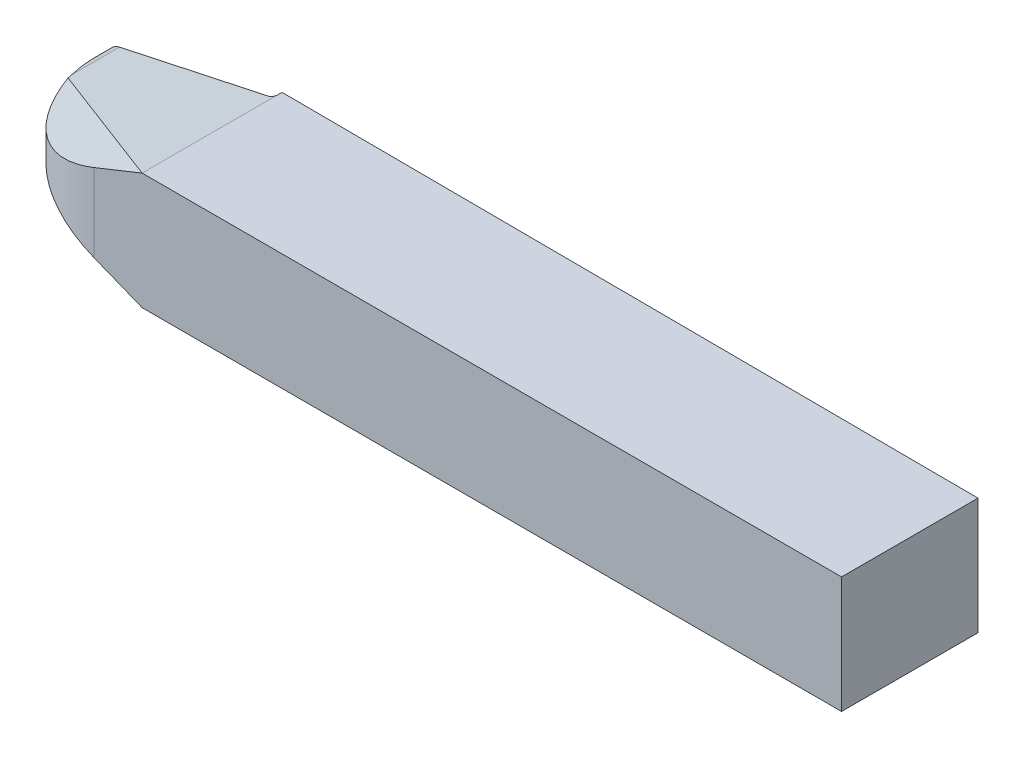
ISO-10303-21;
HEADER;
FILE_DESCRIPTION(('STEP AP214'),'2;1');
FILE_NAME('part.step','',(''),(''),'','','');
FILE_SCHEMA(('AUTOMOTIVE_DESIGN { 1 0 10303 214 1 1 1 1 }'));
ENDSEC;
DATA;
#1=APPLICATION_CONTEXT('core data for automotive mechanical design processes');
#2=APPLICATION_PROTOCOL_DEFINITION('international standard','automotive_design',2000,#1);
#3=PRODUCT_CONTEXT('',#1,'mechanical');
#4=PRODUCT('Part','Part','',(#3));
#5=PRODUCT_RELATED_PRODUCT_CATEGORY('part','',(#4));
#6=PRODUCT_DEFINITION_FORMATION('','',#4);
#7=PRODUCT_DEFINITION_CONTEXT('part definition',#1,'design');
#8=PRODUCT_DEFINITION('design','',#6,#7);
#9=PRODUCT_DEFINITION_SHAPE('','',#8);
#10=(LENGTH_UNIT() NAMED_UNIT(*) SI_UNIT(.MILLI.,.METRE.));
#11=(NAMED_UNIT(*) PLANE_ANGLE_UNIT() SI_UNIT($,.RADIAN.));
#12=(NAMED_UNIT(*) SI_UNIT($,.STERADIAN.) SOLID_ANGLE_UNIT());
#13=UNCERTAINTY_MEASURE_WITH_UNIT(LENGTH_MEASURE(1.E-05),#10,'distance_accuracy_value','');
#14=(GEOMETRIC_REPRESENTATION_CONTEXT(3) GLOBAL_UNCERTAINTY_ASSIGNED_CONTEXT((#13)) GLOBAL_UNIT_ASSIGNED_CONTEXT((#10,
#11,#12)) REPRESENTATION_CONTEXT('',''));
#15=CARTESIAN_POINT('',(0.,0.,0.));
#16=DIRECTION('',(0.,0.,1.));
#17=DIRECTION('',(1.,0.,0.));
#18=AXIS2_PLACEMENT_3D('',#15,#16,#17);
#19=CARTESIAN_POINT('',(-27.,9.99999999999999,24.));
#20=DIRECTION('',(0.,0.,1.));
#21=DIRECTION('',(1.,0.,0.));
#22=AXIS2_PLACEMENT_3D('',#19,#20,#21);
#23=PLANE('',#22);
#24=DIRECTION('',(0.,-1.,0.));
#25=VECTOR('',#24,1.);
#26=CARTESIAN_POINT('',(-8.22267962207384,24.,24.));
#27=LINE('',#26,#25);
#28=CARTESIAN_POINT('',(-8.22267962207384,3.28828490923953,24.));
#29=VERTEX_POINT('',#28);
#30=CARTESIAN_POINT('',(-8.22267962207384,16.7117150907605,24.));
#31=VERTEX_POINT('',#30);
#32=EDGE_CURVE('E129',#29,#31,#27,.F.);
#33=ORIENTED_EDGE('',*,*,#32,.F.);
#34=DIRECTION('',(0.928507329602021,-0.371314070397721,0.));
#35=VECTOR('',#34,1.);
#36=CARTESIAN_POINT('',(-26.7250766098527,10.6874729593666,24.));
#37=LINE('',#36,#35);
#38=CARTESIAN_POINT('',(0.,0.,24.0000000000001));
#39=VERTEX_POINT('',#38);
#40=EDGE_CURVE('E120',#29,#39,#37,.T.);
#41=ORIENTED_EDGE('',*,*,#40,.T.);
#42=DIRECTION('',(1.,0.,0.));
#43=VECTOR('',#42,1.);
#44=CARTESIAN_POINT('',(0.,0.,24.));
#45=LINE('',#44,#43);
#46=CARTESIAN_POINT('',(120.,0.,24.));
#47=VERTEX_POINT('',#46);
#48=EDGE_CURVE('E60',#39,#47,#45,.T.);
#49=ORIENTED_EDGE('',*,*,#48,.T.);
#50=DIRECTION('',(0.,1.,0.));
#51=VECTOR('',#50,1.);
#52=CARTESIAN_POINT('',(120.,0.,24.));
#53=LINE('',#52,#51);
#54=CARTESIAN_POINT('',(120.,20.,24.));
#55=VERTEX_POINT('',#54);
#56=EDGE_CURVE('E55',#47,#55,#53,.T.);
#57=ORIENTED_EDGE('',*,*,#56,.T.);
#58=DIRECTION('',(-1.,0.,0.));
#59=VECTOR('',#58,1.);
#60=CARTESIAN_POINT('',(0.,20.,24.));
#61=LINE('',#60,#59);
#62=CARTESIAN_POINT('',(0.,20.,24.));
#63=VERTEX_POINT('',#62);
#64=EDGE_CURVE('E162',#55,#63,#61,.T.);
#65=ORIENTED_EDGE('',*,*,#64,.T.);
#66=DIRECTION('',(-0.928507329602021,-0.371314070397722,0.));
#67=VECTOR('',#66,1.);
#68=CARTESIAN_POINT('',(-26.7250766098527,9.31252704063335,24.));
#69=LINE('',#68,#67);
#70=EDGE_CURVE('E130',#63,#31,#69,.T.);
#71=ORIENTED_EDGE('',*,*,#70,.T.);
#72=EDGE_LOOP('',(#33,#41,#49,#57,#65,#71));
#73=FACE_BOUND('',#72,.T.);
#74=ADVANCED_FACE('F40',(#73),#23,.T.);
#75=CARTESIAN_POINT('',(-8.22267962207384,24.,4.));
#76=DIRECTION('',(0.,-1.,0.));
#77=DIRECTION('',(0.,0.,-1.));
#78=AXIS2_PLACEMENT_3D('',#75,#76,#77);
#79=CYLINDRICAL_SURFACE('',#78,20.);
#80=CARTESIAN_POINT('',(-8.22267962207384,-2.07069893938296,4.));
#81=DIRECTION('',(-0.360329679452503,-0.901039780384388,0.241432881502315));
#82=DIRECTION('',(0.748545274372848,-0.433736457039127,-0.501550254759404));
#83=AXIS2_PLACEMENT_3D('',#80,#81,#82);
#84=ELLIPSE('',#83,22.1965782592506,20.);
#85=CARTESIAN_POINT('',(-27.5411961478552,7.04186590283247,9.17638090205043));
#86=VERTEX_POINT('',#85);
#87=EDGE_CURVE('E122',#29,#86,#84,.T.);
#88=ORIENTED_EDGE('',*,*,#87,.F.);
#89=ORIENTED_EDGE('',*,*,#32,.T.);
#90=CARTESIAN_POINT('',(-8.22267962207384,22.070698939383,4.));
#91=DIRECTION('',(-0.360329679452504,0.901039780384388,0.241432881502315));
#92=DIRECTION('',(-0.748545274372848,-0.433736457039127,0.501550254759404));
#93=AXIS2_PLACEMENT_3D('',#90,#91,#92);
#94=ELLIPSE('',#93,22.1965782592506,20.);
#95=CARTESIAN_POINT('',(-27.5411961478552,12.9581340971675,9.17638090205043));
#96=VERTEX_POINT('',#95);
#97=EDGE_CURVE('E48',#96,#31,#94,.T.);
#98=ORIENTED_EDGE('',*,*,#97,.F.);
#99=DIRECTION('',(0.,-1.,0.));
#100=VECTOR('',#99,1.);
#101=CARTESIAN_POINT('',(-27.5411961478552,24.,9.17638090205043));
#102=LINE('',#101,#100);
#103=EDGE_CURVE('E181',#96,#86,#102,.T.);
#104=ORIENTED_EDGE('',*,*,#103,.T.);
#105=EDGE_LOOP('',(#88,#89,#98,#104));
#106=FACE_BOUND('',#105,.T.);
#107=ADVANCED_FACE('F261',(#106),#79,.T.);
#108=CARTESIAN_POINT('',(0.,0.,24.));
#109=DIRECTION('',(0.247715827823314,0.968832735122947,0.));
#110=DIRECTION('',(-0.968832735122947,0.247715827823314,0.));
#111=AXIS2_PLACEMENT_3D('',#108,#109,#110);
#112=PLANE('',#111);
#113=DIRECTION('',(0.859051054409004,-0.219646318059651,0.462370826157553));
#114=VECTOR('',#113,1.);
#115=CARTESIAN_POINT('',(0.,0.,24.0000000000001));
#116=LINE('',#115,#114);
#117=EDGE_CURVE('E12',#86,#39,#116,.T.);
#118=ORIENTED_EDGE('',*,*,#117,.F.);
#119=DIRECTION('',(-0.258254179623644,0.0660316745864117,-0.963817719622457));
#120=VECTOR('',#119,1.);
#121=CARTESIAN_POINT('',(-21.8944989920391,5.59809113169716,30.2501415825108));
#122=LINE('',#121,#120);
#123=CARTESIAN_POINT('',(-27.7431474834699,7.09350179463115,8.42268825687986));
#124=VERTEX_POINT('',#123);
#125=EDGE_CURVE('E199',#86,#124,#122,.T.);
#126=ORIENTED_EDGE('',*,*,#125,.T.);
#127=DIRECTION('',(0.,0.,-1.));
#128=VECTOR('',#127,1.);
#129=CARTESIAN_POINT('',(-27.7431474834699,7.09350179463115,24.));
#130=LINE('',#129,#128);
#131=CARTESIAN_POINT('',(-27.7431474834699,7.09350179463115,0.118276628560669));
#132=VERTEX_POINT('',#131);
#133=EDGE_CURVE('E213',#124,#132,#130,.T.);
#134=ORIENTED_EDGE('',*,*,#133,.T.);
#135=DIRECTION('',(0.967586301365597,-0.247397133626849,0.0507090493192555));
#136=VECTOR('',#135,1.);
#137=CARTESIAN_POINT('',(1.10042692495214,-0.281362465151417,1.62990430989102));
#138=LINE('',#137,#136);
#139=CARTESIAN_POINT('',(-0.805596322325437,0.205978754269632,1.53001386423937));
#140=VERTEX_POINT('',#139);
#141=EDGE_CURVE('E208',#132,#140,#138,.T.);
#142=ORIENTED_EDGE('',*,*,#141,.T.);
#143=CARTESIAN_POINT('',(-0.765531499276701,0.195734787020885,0.765531499276701));
#144=DIRECTION('',(0.247715827823314,0.968832735122947,0.));
#145=DIRECTION('',(0.968832735122947,-0.247715827823314,0.));
#146=AXIS2_PLACEMENT_3D('',#143,#144,#145);
#147=ELLIPSE('',#146,0.790158581067715,0.765531499276702);
#148=CARTESIAN_POINT('',(0.,0.,0.765531499276701));
#149=VERTEX_POINT('',#148);
#150=EDGE_CURVE('E140',#140,#149,#147,.T.);
#151=ORIENTED_EDGE('',*,*,#150,.T.);
#152=DIRECTION('',(0.,0.,-1.));
#153=VECTOR('',#152,1.);
#154=CARTESIAN_POINT('',(0.,0.,24.));
#155=LINE('',#154,#153);
#156=EDGE_CURVE('E136',#39,#149,#155,.T.);
#157=ORIENTED_EDGE('',*,*,#156,.F.);
#158=EDGE_LOOP('',(#118,#126,#134,#142,#151,#157));
#159=FACE_BOUND('',#158,.T.);
#160=ADVANCED_FACE('F42',(#159),#112,.F.);
#161=CARTESIAN_POINT('',(0.,20.,24.));
#162=DIRECTION('',(0.247715827823314,-0.968832735122947,0.));
#163=DIRECTION('',(0.968832735122947,0.247715827823314,0.));
#164=AXIS2_PLACEMENT_3D('',#161,#162,#163);
#165=PLANE('',#164);
#166=DIRECTION('',(-0.859051054409004,-0.219646318059651,-0.462370826157553));
#167=VECTOR('',#166,1.);
#168=CARTESIAN_POINT('',(0.,20.,24.0000000000001));
#169=LINE('',#168,#167);
#170=EDGE_CURVE('E157',#63,#96,#169,.T.);
#171=ORIENTED_EDGE('',*,*,#170,.F.);
#172=DIRECTION('',(0.,0.,-1.));
#173=VECTOR('',#172,1.);
#174=CARTESIAN_POINT('',(0.,20.,24.));
#175=LINE('',#174,#173);
#176=CARTESIAN_POINT('',(0.,20.,0.765531499276701));
#177=VERTEX_POINT('',#176);
#178=EDGE_CURVE('E219',#63,#177,#175,.T.);
#179=ORIENTED_EDGE('',*,*,#178,.T.);
#180=CARTESIAN_POINT('',(-0.765531499276701,19.8042652129791,0.765531499276701));
#181=DIRECTION('',(0.247715827823314,-0.968832735122947,0.));
#182=DIRECTION('',(-0.968832735122947,-0.247715827823314,0.));
#183=AXIS2_PLACEMENT_3D('',#180,#181,#182);
#184=ELLIPSE('',#183,0.790158581067715,0.765531499276702);
#185=CARTESIAN_POINT('',(-0.805596322325437,19.7940212457304,1.53001386423937));
#186=VERTEX_POINT('',#185);
#187=EDGE_CURVE('E145',#177,#186,#184,.T.);
#188=ORIENTED_EDGE('',*,*,#187,.T.);
#189=DIRECTION('',(-0.967586301365597,-0.247397133626849,-0.0507090493192555));
#190=VECTOR('',#189,1.);
#191=CARTESIAN_POINT('',(1.10042692495214,20.2813624651514,1.62990430989102));
#192=LINE('',#191,#190);
#193=CARTESIAN_POINT('',(-27.7431474834699,12.9064982053688,0.118276628560669));
#194=VERTEX_POINT('',#193);
#195=EDGE_CURVE('E205',#186,#194,#192,.T.);
#196=ORIENTED_EDGE('',*,*,#195,.T.);
#197=DIRECTION('',(0.,0.,-1.));
#198=VECTOR('',#197,1.);
#199=CARTESIAN_POINT('',(-27.7431474834699,12.9064982053688,24.));
#200=LINE('',#199,#198);
#201=CARTESIAN_POINT('',(-27.7431474834699,12.9064982053688,8.42268825687986));
#202=VERTEX_POINT('',#201);
#203=EDGE_CURVE('E216',#202,#194,#200,.T.);
#204=ORIENTED_EDGE('',*,*,#203,.F.);
#205=DIRECTION('',(0.258254179623644,0.0660316745864117,0.963817719622457));
#206=VECTOR('',#205,1.);
#207=CARTESIAN_POINT('',(-21.8944989920391,14.4019088683028,30.2501415825108));
#208=LINE('',#207,#206);
#209=EDGE_CURVE('E196',#202,#96,#208,.T.);
#210=ORIENTED_EDGE('',*,*,#209,.T.);
#211=EDGE_LOOP('',(#171,#179,#188,#196,#204,#210));
#212=FACE_BOUND('',#211,.T.);
#213=ADVANCED_FACE('F233',(#212),#165,.F.);
#214=CARTESIAN_POINT('',(-27.,9.99999999999999,24.));
#215=DIRECTION('',(0.,0.,-1.));
#216=DIRECTION('',(-1.,0.,0.));
#217=AXIS2_PLACEMENT_3D('',#214,#215,#216);
#218=CYLINDRICAL_SURFACE('',#217,3.);
#219=ORIENTED_EDGE('',*,*,#203,.T.);
#220=CARTESIAN_POINT('',(-27.,9.99999999999999,0.157223337849101));
#221=DIRECTION('',(-0.0523359562429367,0.,0.998629534754574));
#222=DIRECTION('',(-0.998629534754574,0.,-0.0523359562429367));
#223=AXIS2_PLACEMENT_3D('',#220,#221,#222);
#224=ELLIPSE('',#223,3.00411703799376,3.);
#225=CARTESIAN_POINT('',(-30.,9.99999999999999,0.));
#226=VERTEX_POINT('',#225);
#227=EDGE_CURVE('E201',#194,#226,#224,.T.);
#228=ORIENTED_EDGE('',*,*,#227,.T.);
#229=CARTESIAN_POINT('',(-27.,9.99999999999999,11.1961524227066));
#230=DIRECTION('',(0.965925826289068,0.,-0.258819045102521));
#231=DIRECTION('',(-0.258819045102521,0.,-0.965925826289068));
#232=AXIS2_PLACEMENT_3D('',#229,#230,#231);
#233=ELLIPSE('',#232,11.5911099154688,3.);
#234=EDGE_CURVE('E195',#226,#202,#233,.T.);
#235=ORIENTED_EDGE('',*,*,#234,.T.);
#236=EDGE_LOOP('',(#219,#228,#235));
#237=FACE_BOUND('',#236,.T.);
#238=ADVANCED_FACE('F240',(#237),#218,.T.);
#239=CARTESIAN_POINT('',(0.,0.,24.));
#240=DIRECTION('',(0.,1.,0.));
#241=DIRECTION('',(0.,0.,1.));
#242=AXIS2_PLACEMENT_3D('',#239,#240,#241);
#243=PLANE('',#242);
#244=DIRECTION('',(0.,0.,1.));
#245=VECTOR('',#244,1.);
#246=CARTESIAN_POINT('',(0.,0.,0.));
#247=LINE('',#246,#245);
#248=CARTESIAN_POINT('',(0.,0.,0.));
#249=VERTEX_POINT('',#248);
#250=EDGE_CURVE('E170',#249,#149,#247,.T.);
#251=ORIENTED_EDGE('',*,*,#250,.F.);
#252=DIRECTION('',(-0.999987809393299,0.,-0.00493771858157895));
#253=VECTOR('',#252,1.);
#254=CARTESIAN_POINT('',(0.,0.,0.));
#255=LINE('',#254,#253);
#256=CARTESIAN_POINT('',(120.,0.,0.592533453131758));
#257=VERTEX_POINT('',#256);
#258=EDGE_CURVE('E165',#257,#249,#255,.T.);
#259=ORIENTED_EDGE('',*,*,#258,.F.);
#260=DIRECTION('',(0.,0.,-1.));
#261=VECTOR('',#260,1.);
#262=CARTESIAN_POINT('',(120.,0.,24.));
#263=LINE('',#262,#261);
#264=EDGE_CURVE('E139',#47,#257,#263,.T.);
#265=ORIENTED_EDGE('',*,*,#264,.F.);
#266=ORIENTED_EDGE('',*,*,#48,.F.);
#267=ORIENTED_EDGE('',*,*,#156,.T.);
#268=EDGE_LOOP('',(#251,#259,#265,#266,#267));
#269=FACE_BOUND('',#268,.T.);
#270=ADVANCED_FACE('F135',(#269),#243,.F.);
#271=CARTESIAN_POINT('',(120.,0.,24.));
#272=DIRECTION('',(-1.,0.,0.));
#273=DIRECTION('',(0.,0.,1.));
#274=AXIS2_PLACEMENT_3D('',#271,#272,#273);
#275=PLANE('',#274);
#276=ORIENTED_EDGE('',*,*,#264,.T.);
#277=DIRECTION('',(0.,1.,0.));
#278=VECTOR('',#277,1.);
#279=CARTESIAN_POINT('',(120.,0.,0.592533453131761));
#280=LINE('',#279,#278);
#281=CARTESIAN_POINT('',(120.,20.,0.592533453131759));
#282=VERTEX_POINT('',#281);
#283=EDGE_CURVE('E189',#257,#282,#280,.T.);
#284=ORIENTED_EDGE('',*,*,#283,.T.);
#285=DIRECTION('',(0.,0.,-1.));
#286=VECTOR('',#285,1.);
#287=CARTESIAN_POINT('',(120.,20.,24.));
#288=LINE('',#287,#286);
#289=EDGE_CURVE('E147',#55,#282,#288,.T.);
#290=ORIENTED_EDGE('',*,*,#289,.F.);
#291=ORIENTED_EDGE('',*,*,#56,.F.);
#292=EDGE_LOOP('',(#276,#284,#290,#291));
#293=FACE_BOUND('',#292,.T.);
#294=ADVANCED_FACE('F225',(#293),#275,.F.);
#295=CARTESIAN_POINT('',(0.,20.,24.));
#296=DIRECTION('',(0.,-1.,0.));
#297=DIRECTION('',(1.,0.,0.));
#298=AXIS2_PLACEMENT_3D('',#295,#296,#297);
#299=PLANE('',#298);
#300=ORIENTED_EDGE('',*,*,#289,.T.);
#301=DIRECTION('',(-0.999987809393299,0.,-0.00493771858157895));
#302=VECTOR('',#301,1.);
#303=CARTESIAN_POINT('',(0.118503801307049,20.,0.000585145554982125));
#304=LINE('',#303,#302);
#305=CARTESIAN_POINT('',(0.,20.,0.));
#306=VERTEX_POINT('',#305);
#307=EDGE_CURVE('E186',#282,#306,#304,.T.);
#308=ORIENTED_EDGE('',*,*,#307,.T.);
#309=DIRECTION('',(0.,0.,1.));
#310=VECTOR('',#309,1.);
#311=CARTESIAN_POINT('',(0.,20.,24.));
#312=LINE('',#311,#310);
#313=EDGE_CURVE('E183',#306,#177,#312,.T.);
#314=ORIENTED_EDGE('',*,*,#313,.T.);
#315=ORIENTED_EDGE('',*,*,#178,.F.);
#316=ORIENTED_EDGE('',*,*,#64,.F.);
#317=EDGE_LOOP('',(#300,#308,#314,#315,#316));
#318=FACE_BOUND('',#317,.T.);
#319=ADVANCED_FACE('F223',(#318),#299,.F.);
#320=EDGE_CURVE('E192',#124,#226,#233,.T.);
#321=ORIENTED_EDGE('',*,*,#320,.T.);
#322=EDGE_CURVE('E204',#226,#132,#224,.T.);
#323=ORIENTED_EDGE('',*,*,#322,.T.);
#324=ORIENTED_EDGE('',*,*,#133,.F.);
#325=EDGE_LOOP('',(#321,#323,#324));
#326=FACE_BOUND('',#325,.T.);
#327=ADVANCED_FACE('F245',(#326),#218,.T.);
#328=CARTESIAN_POINT('',(-30.,24.,0.));
#329=DIRECTION('',(0.965925826289068,0.,-0.258819045102521));
#330=DIRECTION('',(-0.258819045102521,0.,-0.965925826289068));
#331=AXIS2_PLACEMENT_3D('',#328,#329,#330);
#332=PLANE('',#331);
#333=ORIENTED_EDGE('',*,*,#103,.F.);
#334=ORIENTED_EDGE('',*,*,#209,.F.);
#335=ORIENTED_EDGE('',*,*,#234,.F.);
#336=ORIENTED_EDGE('',*,*,#320,.F.);
#337=ORIENTED_EDGE('',*,*,#125,.F.);
#338=EDGE_LOOP('',(#333,#334,#335,#336,#337));
#339=FACE_BOUND('',#338,.T.);
#340=ADVANCED_FACE('F238',(#339),#332,.F.);
#341=CARTESIAN_POINT('',(-0.765531499276701,24.,0.765531499276701));
#342=DIRECTION('',(0.,-1.,0.));
#343=DIRECTION('',(0.,0.,-1.));
#344=AXIS2_PLACEMENT_3D('',#341,#342,#343);
#345=CYLINDRICAL_SURFACE('',#344,0.765531499276702);
#346=DIRECTION('',(0.,-1.,0.));
#347=VECTOR('',#346,1.);
#348=CARTESIAN_POINT('',(-0.805596322325437,24.,1.53001386423937));
#349=LINE('',#348,#347);
#350=EDGE_CURVE('E173',#186,#140,#349,.T.);
#351=ORIENTED_EDGE('',*,*,#350,.F.);
#352=ORIENTED_EDGE('',*,*,#187,.F.);
#353=DIRECTION('',(0.,-1.,0.));
#354=VECTOR('',#353,1.);
#355=CARTESIAN_POINT('',(0.,24.,0.765531499276701));
#356=LINE('',#355,#354);
#357=EDGE_CURVE('E176',#177,#149,#356,.T.);
#358=ORIENTED_EDGE('',*,*,#357,.T.);
#359=ORIENTED_EDGE('',*,*,#150,.F.);
#360=EDGE_LOOP('',(#351,#352,#358,#359));
#361=FACE_BOUND('',#360,.T.);
#362=ADVANCED_FACE('F249',(#361),#345,.F.);
#363=CARTESIAN_POINT('',(-30.,24.,0.));
#364=DIRECTION('',(-0.0523359562429367,0.,0.998629534754574));
#365=DIRECTION('',(0.998629534754574,0.,0.0523359562429367));
#366=AXIS2_PLACEMENT_3D('',#363,#364,#365);
#367=PLANE('',#366);
#368=ORIENTED_EDGE('',*,*,#322,.F.);
#369=ORIENTED_EDGE('',*,*,#227,.F.);
#370=ORIENTED_EDGE('',*,*,#195,.F.);
#371=ORIENTED_EDGE('',*,*,#350,.T.);
#372=ORIENTED_EDGE('',*,*,#141,.F.);
#373=EDGE_LOOP('',(#368,#369,#370,#371,#372));
#374=FACE_BOUND('',#373,.T.);
#375=ADVANCED_FACE('F246',(#374),#367,.F.);
#376=CARTESIAN_POINT('',(0.,24.,0.));
#377=DIRECTION('',(-0.00493771858157895,0.,0.999987809393299));
#378=DIRECTION('',(0.999987809393299,0.,0.00493771858157895));
#379=AXIS2_PLACEMENT_3D('',#376,#377,#378);
#380=PLANE('',#379);
#381=ORIENTED_EDGE('',*,*,#258,.T.);
#382=DIRECTION('',(0.,-1.,0.));
#383=VECTOR('',#382,1.);
#384=CARTESIAN_POINT('',(0.,24.,0.));
#385=LINE('',#384,#383);
#386=EDGE_CURVE('E178',#306,#249,#385,.T.);
#387=ORIENTED_EDGE('',*,*,#386,.F.);
#388=ORIENTED_EDGE('',*,*,#307,.F.);
#389=ORIENTED_EDGE('',*,*,#283,.F.);
#390=EDGE_LOOP('',(#381,#387,#388,#389));
#391=FACE_BOUND('',#390,.T.);
#392=ADVANCED_FACE('F227',(#391),#380,.F.);
#393=CARTESIAN_POINT('',(0.,24.,0.));
#394=DIRECTION('',(1.,0.,0.));
#395=DIRECTION('',(0.,0.,-1.));
#396=AXIS2_PLACEMENT_3D('',#393,#394,#395);
#397=PLANE('',#396);
#398=ORIENTED_EDGE('',*,*,#386,.T.);
#399=ORIENTED_EDGE('',*,*,#250,.T.);
#400=ORIENTED_EDGE('',*,*,#357,.F.);
#401=ORIENTED_EDGE('',*,*,#313,.F.);
#402=EDGE_LOOP('',(#398,#399,#400,#401));
#403=FACE_BOUND('',#402,.T.);
#404=ADVANCED_FACE('F231',(#403),#397,.F.);
#405=CARTESIAN_POINT('',(-8.58131789202178,21.4584288493369,5.74976868102057));
#406=DIRECTION('',(-0.360329679452504,0.901039780384388,0.241432881502315));
#407=DIRECTION('',(-0.928507329602021,-0.371314070397722,0.));
#408=AXIS2_PLACEMENT_3D('',#405,#406,#407);
#409=PLANE('',#408);
#410=ORIENTED_EDGE('',*,*,#170,.T.);
#411=ORIENTED_EDGE('',*,*,#97,.T.);
#412=ORIENTED_EDGE('',*,*,#70,.F.);
#413=EDGE_LOOP('',(#410,#411,#412));
#414=FACE_BOUND('',#413,.T.);
#415=ADVANCED_FACE('F155',(#414),#409,.T.);
#416=CARTESIAN_POINT('',(-8.58131789202177,-1.4584288493369,5.74976868102057));
#417=DIRECTION('',(-0.360329679452503,-0.901039780384388,0.241432881502315));
#418=DIRECTION('',(-0.928507329602021,0.371314070397721,0.));
#419=AXIS2_PLACEMENT_3D('',#416,#417,#418);
#420=PLANE('',#419);
#421=ORIENTED_EDGE('',*,*,#87,.T.);
#422=ORIENTED_EDGE('',*,*,#117,.T.);
#423=ORIENTED_EDGE('',*,*,#40,.F.);
#424=EDGE_LOOP('',(#421,#422,#423));
#425=FACE_BOUND('',#424,.T.);
#426=ADVANCED_FACE('F119',(#425),#420,.T.);
#427=CLOSED_SHELL('',(#74,#107,#160,#213,#238,#270,#294,#319,#327,#340,#362,#375,#392,#404,#415,#426));
#428=MANIFOLD_SOLID_BREP('B2',#427);
#429=ADVANCED_BREP_SHAPE_REPRESENTATION('',(#18,#428),#14);
#430=SHAPE_DEFINITION_REPRESENTATION(#9,#429);
ENDSEC;
END-ISO-10303-21;
